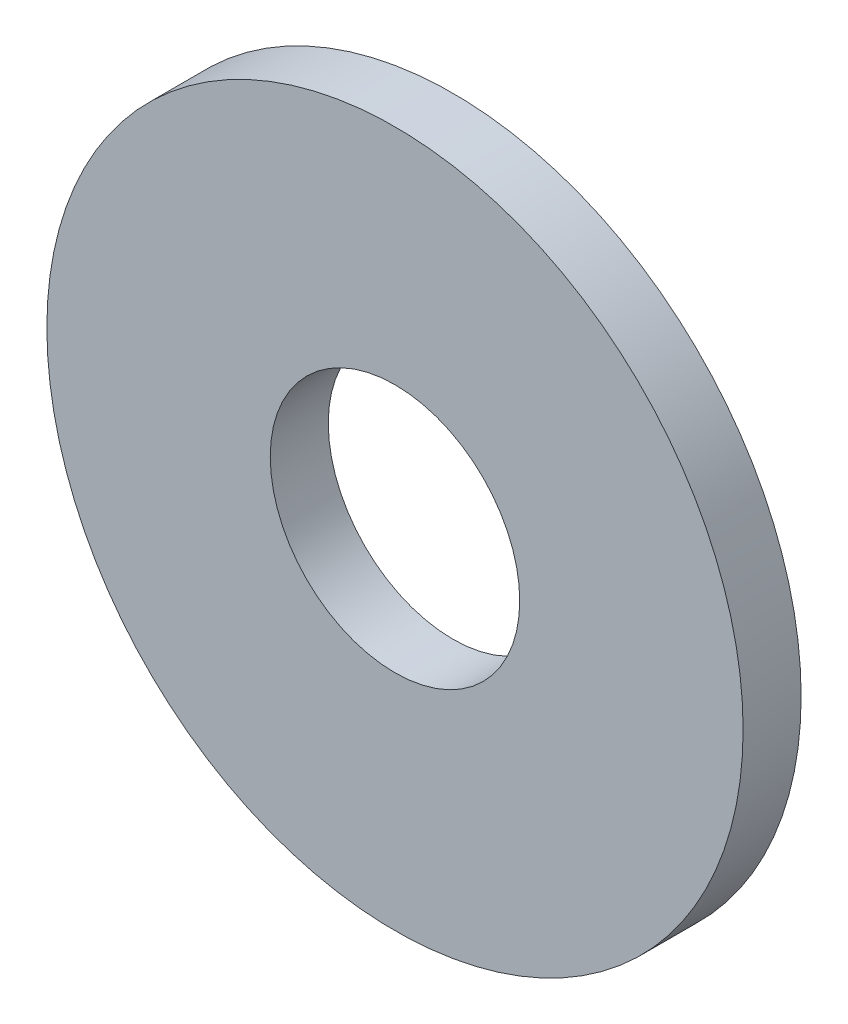
ISO-10303-21;
HEADER;
FILE_DESCRIPTION(('STEP AP214'),'2;1');
FILE_NAME('part.step','',(''),(''),'','','');
FILE_SCHEMA(('AUTOMOTIVE_DESIGN { 1 0 10303 214 1 1 1 1 }'));
ENDSEC;
DATA;
#1=APPLICATION_CONTEXT('core data for automotive mechanical design processes');
#2=APPLICATION_PROTOCOL_DEFINITION('international standard','automotive_design',2000,#1);
#3=PRODUCT_CONTEXT('',#1,'mechanical');
#4=PRODUCT('Part','Part','',(#3));
#5=PRODUCT_RELATED_PRODUCT_CATEGORY('part','',(#4));
#6=PRODUCT_DEFINITION_FORMATION('','',#4);
#7=PRODUCT_DEFINITION_CONTEXT('part definition',#1,'design');
#8=PRODUCT_DEFINITION('design','',#6,#7);
#9=PRODUCT_DEFINITION_SHAPE('','',#8);
#10=(LENGTH_UNIT() NAMED_UNIT(*) SI_UNIT(.MILLI.,.METRE.));
#11=(NAMED_UNIT(*) PLANE_ANGLE_UNIT() SI_UNIT($,.RADIAN.));
#12=(NAMED_UNIT(*) SI_UNIT($,.STERADIAN.) SOLID_ANGLE_UNIT());
#13=UNCERTAINTY_MEASURE_WITH_UNIT(LENGTH_MEASURE(1.E-05),#10,'distance_accuracy_value','');
#14=(GEOMETRIC_REPRESENTATION_CONTEXT(3) GLOBAL_UNCERTAINTY_ASSIGNED_CONTEXT((#13)) GLOBAL_UNIT_ASSIGNED_CONTEXT((#10,
#11,#12)) REPRESENTATION_CONTEXT('',''));
#15=CARTESIAN_POINT('',(0.,0.,0.));
#16=DIRECTION('',(0.,0.,1.));
#17=DIRECTION('',(1.,0.,0.));
#18=AXIS2_PLACEMENT_3D('',#15,#16,#17);
#19=CARTESIAN_POINT('',(0.,0.,0.5));
#20=DIRECTION('',(0.,0.,1.));
#21=DIRECTION('',(1.,0.,0.));
#22=AXIS2_PLACEMENT_3D('',#19,#20,#21);
#23=PLANE('',#22);
#24=CARTESIAN_POINT('',(0.,0.,0.5));
#25=DIRECTION('',(0.,0.,1.));
#26=DIRECTION('',(1.,0.,0.));
#27=AXIS2_PLACEMENT_3D('',#24,#25,#26);
#28=CIRCLE('',#27,6.);
#29=CARTESIAN_POINT('',(6.,0.,0.5));
#30=VERTEX_POINT('',#29);
#31=EDGE_CURVE('E10',#30,#30,#28,.T.);
#32=ORIENTED_EDGE('',*,*,#31,.T.);
#33=EDGE_LOOP('',(#32));
#34=FACE_BOUND('',#33,.T.);
#35=CARTESIAN_POINT('',(0.,0.,0.5));
#36=DIRECTION('',(0.,0.,1.));
#37=DIRECTION('',(1.,0.,0.));
#38=AXIS2_PLACEMENT_3D('',#35,#36,#37);
#39=CIRCLE('',#38,2.15);
#40=CARTESIAN_POINT('',(2.15,0.,0.5));
#41=VERTEX_POINT('',#40);
#42=EDGE_CURVE('E43',#41,#41,#39,.T.);
#43=ORIENTED_EDGE('',*,*,#42,.F.);
#44=EDGE_LOOP('',(#43));
#45=FACE_BOUND('',#44,.T.);
#46=ADVANCED_FACE('F32',(#34,#45),#23,.T.);
#47=CARTESIAN_POINT('',(0.,0.,-0.5));
#48=DIRECTION('',(0.,0.,1.));
#49=DIRECTION('',(1.,0.,0.));
#50=AXIS2_PLACEMENT_3D('',#47,#48,#49);
#51=PLANE('',#50);
#52=CARTESIAN_POINT('',(0.,0.,-0.5));
#53=DIRECTION('',(0.,0.,1.));
#54=DIRECTION('',(1.,0.,0.));
#55=AXIS2_PLACEMENT_3D('',#52,#53,#54);
#56=CIRCLE('',#55,6.);
#57=CARTESIAN_POINT('',(6.,0.,-0.5));
#58=VERTEX_POINT('',#57);
#59=EDGE_CURVE('E36',#58,#58,#56,.T.);
#60=ORIENTED_EDGE('',*,*,#59,.F.);
#61=EDGE_LOOP('',(#60));
#62=FACE_BOUND('',#61,.T.);
#63=CARTESIAN_POINT('',(0.,0.,-0.5));
#64=DIRECTION('',(0.,0.,1.));
#65=DIRECTION('',(1.,0.,0.));
#66=AXIS2_PLACEMENT_3D('',#63,#64,#65);
#67=CIRCLE('',#66,2.15);
#68=CARTESIAN_POINT('',(2.15,0.,-0.5));
#69=VERTEX_POINT('',#68);
#70=EDGE_CURVE('E45',#69,#69,#67,.T.);
#71=ORIENTED_EDGE('',*,*,#70,.T.);
#72=EDGE_LOOP('',(#71));
#73=FACE_BOUND('',#72,.T.);
#74=ADVANCED_FACE('F55',(#62,#73),#51,.F.);
#75=CARTESIAN_POINT('',(0.,0.,0.5));
#76=DIRECTION('',(0.,0.,-1.));
#77=DIRECTION('',(-1.,0.,0.));
#78=AXIS2_PLACEMENT_3D('',#75,#76,#77);
#79=CYLINDRICAL_SURFACE('',#78,6.);
#80=ORIENTED_EDGE('',*,*,#31,.F.);
#81=EDGE_LOOP('',(#80));
#82=FACE_BOUND('',#81,.T.);
#83=ORIENTED_EDGE('',*,*,#59,.T.);
#84=EDGE_LOOP('',(#83));
#85=FACE_BOUND('',#84,.T.);
#86=ADVANCED_FACE('F34',(#82,#85),#79,.T.);
#87=CARTESIAN_POINT('',(0.,0.,0.5));
#88=DIRECTION('',(0.,0.,-1.));
#89=DIRECTION('',(-1.,0.,0.));
#90=AXIS2_PLACEMENT_3D('',#87,#88,#89);
#91=CYLINDRICAL_SURFACE('',#90,2.15);
#92=ORIENTED_EDGE('',*,*,#42,.T.);
#93=EDGE_LOOP('',(#92));
#94=FACE_BOUND('',#93,.T.);
#95=ORIENTED_EDGE('',*,*,#70,.F.);
#96=EDGE_LOOP('',(#95));
#97=FACE_BOUND('',#96,.T.);
#98=ADVANCED_FACE('F51',(#94,#97),#91,.F.);
#99=CLOSED_SHELL('',(#46,#74,#86,#98));
#100=MANIFOLD_SOLID_BREP('B2',#99);
#101=ADVANCED_BREP_SHAPE_REPRESENTATION('',(#18,#100),#14);
#102=SHAPE_DEFINITION_REPRESENTATION(#9,#101);
ENDSEC;
END-ISO-10303-21;
